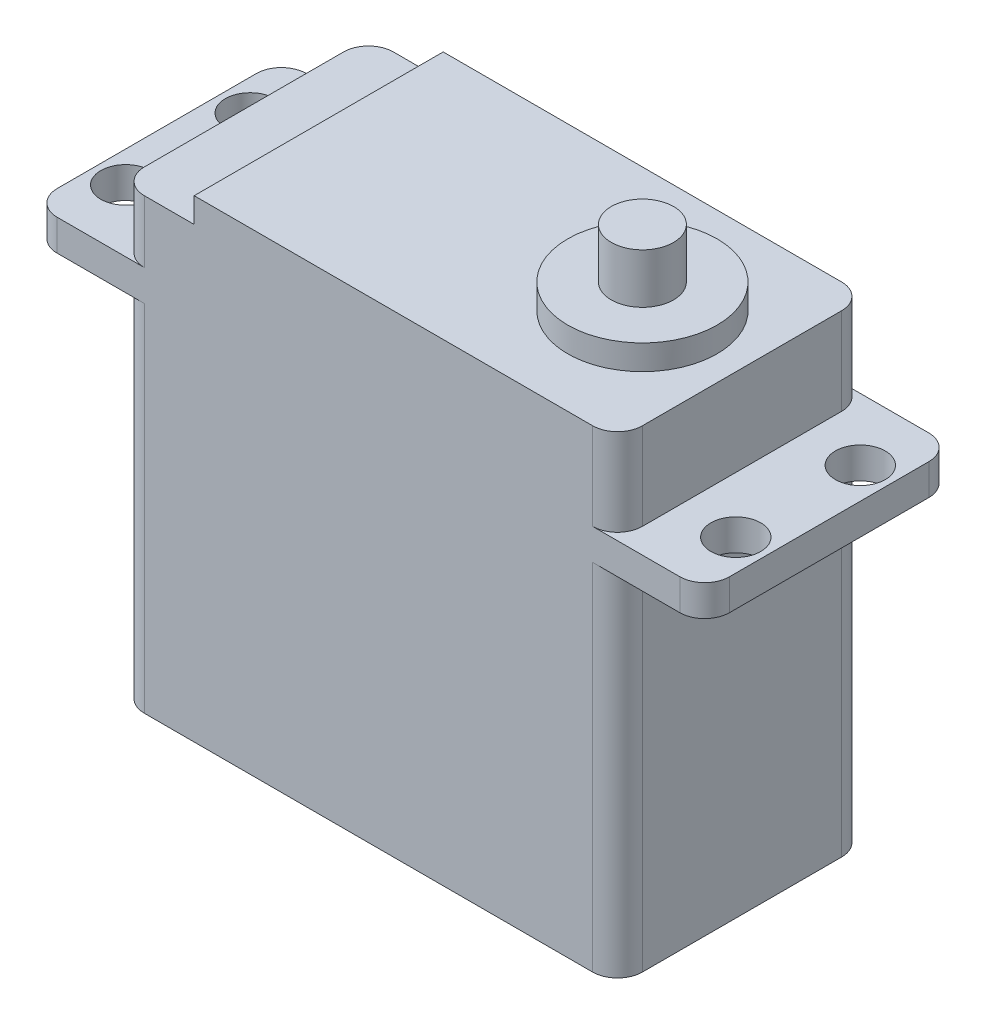
ISO-10303-21;
HEADER;
FILE_DESCRIPTION(('STEP AP214'),'2;1');
FILE_NAME('part.step','',(''),(''),'','','');
FILE_SCHEMA(('AUTOMOTIVE_DESIGN { 1 0 10303 214 1 1 1 1 }'));
ENDSEC;
DATA;
#1=APPLICATION_CONTEXT('core data for automotive mechanical design processes');
#2=APPLICATION_PROTOCOL_DEFINITION('international standard','automotive_design',2000,#1);
#3=PRODUCT_CONTEXT('',#1,'mechanical');
#4=PRODUCT('Part','Part','',(#3));
#5=PRODUCT_RELATED_PRODUCT_CATEGORY('part','',(#4));
#6=PRODUCT_DEFINITION_FORMATION('','',#4);
#7=PRODUCT_DEFINITION_CONTEXT('part definition',#1,'design');
#8=PRODUCT_DEFINITION('design','',#6,#7);
#9=PRODUCT_DEFINITION_SHAPE('','',#8);
#10=(LENGTH_UNIT() NAMED_UNIT(*) SI_UNIT(.MILLI.,.METRE.));
#11=(NAMED_UNIT(*) PLANE_ANGLE_UNIT() SI_UNIT($,.RADIAN.));
#12=(NAMED_UNIT(*) SI_UNIT($,.STERADIAN.) SOLID_ANGLE_UNIT());
#13=UNCERTAINTY_MEASURE_WITH_UNIT(LENGTH_MEASURE(1.E-05),#10,'distance_accuracy_value','');
#14=(GEOMETRIC_REPRESENTATION_CONTEXT(3) GLOBAL_UNCERTAINTY_ASSIGNED_CONTEXT((#13)) GLOBAL_UNIT_ASSIGNED_CONTEXT((#10,
#11,#12)) REPRESENTATION_CONTEXT('',''));
#15=CARTESIAN_POINT('',(0.,0.,0.));
#16=DIRECTION('',(0.,0.,1.));
#17=DIRECTION('',(1.,0.,0.));
#18=AXIS2_PLACEMENT_3D('',#15,#16,#17);
#19=CARTESIAN_POINT('',(40.,36.,-10.));
#20=DIRECTION('',(-1.,0.,0.));
#21=DIRECTION('',(0.,0.,1.));
#22=AXIS2_PLACEMENT_3D('',#19,#20,#21);
#23=PLANE('',#22);
#24=DIRECTION('',(0.,0.,1.));
#25=VECTOR('',#24,1.);
#26=CARTESIAN_POINT('',(40.,31.,10.));
#27=LINE('',#26,#25);
#28=CARTESIAN_POINT('',(40.,31.,-8.));
#29=VERTEX_POINT('',#28);
#30=CARTESIAN_POINT('',(40.,31.,7.99999999999999));
#31=VERTEX_POINT('',#30);
#32=EDGE_CURVE('E385',#29,#31,#27,.T.);
#33=ORIENTED_EDGE('',*,*,#32,.F.);
#34=DIRECTION('',(0.,-1.,0.));
#35=VECTOR('',#34,1.);
#36=CARTESIAN_POINT('',(40.,36.,-8.));
#37=LINE('',#36,#35);
#38=CARTESIAN_POINT('',(40.,38.,-8.));
#39=VERTEX_POINT('',#38);
#40=EDGE_CURVE('E333',#29,#39,#37,.F.);
#41=ORIENTED_EDGE('',*,*,#40,.T.);
#42=DIRECTION('',(0.,0.,-1.));
#43=VECTOR('',#42,1.);
#44=CARTESIAN_POINT('',(40.,38.,-10.));
#45=LINE('',#44,#43);
#46=CARTESIAN_POINT('',(40.,38.,7.99999999999999));
#47=VERTEX_POINT('',#46);
#48=EDGE_CURVE('E221',#47,#39,#45,.T.);
#49=ORIENTED_EDGE('',*,*,#48,.F.);
#50=DIRECTION('',(0.,-1.,0.));
#51=VECTOR('',#50,1.);
#52=CARTESIAN_POINT('',(40.,36.,7.99999999999999));
#53=LINE('',#52,#51);
#54=EDGE_CURVE('E330',#47,#31,#53,.T.);
#55=ORIENTED_EDGE('',*,*,#54,.T.);
#56=EDGE_LOOP('',(#33,#41,#49,#55));
#57=FACE_BOUND('',#56,.T.);
#58=ADVANCED_FACE('F37',(#57),#23,.F.);
#59=DIRECTION('',(0.,0.,-1.));
#60=VECTOR('',#59,1.);
#61=CARTESIAN_POINT('',(40.,0.,-10.));
#62=LINE('',#61,#60);
#63=CARTESIAN_POINT('',(40.,0.,7.99999999999999));
#64=VERTEX_POINT('',#63);
#65=CARTESIAN_POINT('',(40.,0.,-8.));
#66=VERTEX_POINT('',#65);
#67=EDGE_CURVE('E255',#64,#66,#62,.T.);
#68=ORIENTED_EDGE('',*,*,#67,.T.);
#69=DIRECTION('',(0.,-1.,0.));
#70=VECTOR('',#69,1.);
#71=CARTESIAN_POINT('',(40.,36.,-8.));
#72=LINE('',#71,#70);
#73=CARTESIAN_POINT('',(40.,28.5,-8.));
#74=VERTEX_POINT('',#73);
#75=EDGE_CURVE('E359',#66,#74,#72,.F.);
#76=ORIENTED_EDGE('',*,*,#75,.T.);
#77=DIRECTION('',(0.,0.,-1.));
#78=VECTOR('',#77,1.);
#79=CARTESIAN_POINT('',(40.,28.5,-10.));
#80=LINE('',#79,#78);
#81=CARTESIAN_POINT('',(40.,28.5,7.99999999999999));
#82=VERTEX_POINT('',#81);
#83=EDGE_CURVE('E376',#82,#74,#80,.T.);
#84=ORIENTED_EDGE('',*,*,#83,.F.);
#85=DIRECTION('',(0.,-1.,0.));
#86=VECTOR('',#85,1.);
#87=CARTESIAN_POINT('',(40.,36.,7.99999999999999));
#88=LINE('',#87,#86);
#89=EDGE_CURVE('E356',#82,#64,#88,.T.);
#90=ORIENTED_EDGE('',*,*,#89,.T.);
#91=EDGE_LOOP('',(#68,#76,#84,#90));
#92=FACE_BOUND('',#91,.T.);
#93=ADVANCED_FACE('F382',(#92),#23,.F.);
#94=CARTESIAN_POINT('',(0.,36.,0.));
#95=DIRECTION('',(1.,0.,0.));
#96=DIRECTION('',(0.,0.,-1.));
#97=AXIS2_PLACEMENT_3D('',#94,#95,#96);
#98=PLANE('',#97);
#99=DIRECTION('',(0.,0.,1.));
#100=VECTOR('',#99,1.);
#101=CARTESIAN_POINT('',(0.,36.,10.));
#102=LINE('',#101,#100);
#103=CARTESIAN_POINT('',(0.,36.,-8.));
#104=VERTEX_POINT('',#103);
#105=CARTESIAN_POINT('',(0.,36.,8.));
#106=VERTEX_POINT('',#105);
#107=EDGE_CURVE('E245',#104,#106,#102,.T.);
#108=ORIENTED_EDGE('',*,*,#107,.F.);
#109=DIRECTION('',(0.,-1.,0.));
#110=VECTOR('',#109,1.);
#111=CARTESIAN_POINT('',(0.,36.,-8.));
#112=LINE('',#111,#110);
#113=CARTESIAN_POINT('',(0.,31.,-8.));
#114=VERTEX_POINT('',#113);
#115=EDGE_CURVE('E267',#104,#114,#112,.T.);
#116=ORIENTED_EDGE('',*,*,#115,.T.);
#117=DIRECTION('',(0.,0.,-1.));
#118=VECTOR('',#117,1.);
#119=CARTESIAN_POINT('',(0.,31.,-10.));
#120=LINE('',#119,#118);
#121=CARTESIAN_POINT('',(0.,31.,8.));
#122=VERTEX_POINT('',#121);
#123=EDGE_CURVE('E462',#122,#114,#120,.T.);
#124=ORIENTED_EDGE('',*,*,#123,.F.);
#125=DIRECTION('',(0.,-1.,0.));
#126=VECTOR('',#125,1.);
#127=CARTESIAN_POINT('',(0.,36.,8.));
#128=LINE('',#127,#126);
#129=EDGE_CURVE('E265',#122,#106,#128,.F.);
#130=ORIENTED_EDGE('',*,*,#129,.T.);
#131=EDGE_LOOP('',(#108,#116,#124,#130));
#132=FACE_BOUND('',#131,.T.);
#133=ADVANCED_FACE('F506',(#132),#98,.F.);
#134=DIRECTION('',(0.,0.,1.));
#135=VECTOR('',#134,1.);
#136=CARTESIAN_POINT('',(0.,0.,0.));
#137=LINE('',#136,#135);
#138=CARTESIAN_POINT('',(0.,0.,-8.));
#139=VERTEX_POINT('',#138);
#140=CARTESIAN_POINT('',(0.,0.,8.));
#141=VERTEX_POINT('',#140);
#142=EDGE_CURVE('E249',#139,#141,#137,.T.);
#143=ORIENTED_EDGE('',*,*,#142,.T.);
#144=DIRECTION('',(0.,-1.,0.));
#145=VECTOR('',#144,1.);
#146=CARTESIAN_POINT('',(0.,36.,8.));
#147=LINE('',#146,#145);
#148=CARTESIAN_POINT('',(0.,28.5,8.));
#149=VERTEX_POINT('',#148);
#150=EDGE_CURVE('E297',#141,#149,#147,.F.);
#151=ORIENTED_EDGE('',*,*,#150,.T.);
#152=DIRECTION('',(0.,0.,1.));
#153=VECTOR('',#152,1.);
#154=CARTESIAN_POINT('',(0.,28.5,10.));
#155=LINE('',#154,#153);
#156=CARTESIAN_POINT('',(0.,28.5,-8.));
#157=VERTEX_POINT('',#156);
#158=EDGE_CURVE('E407',#157,#149,#155,.T.);
#159=ORIENTED_EDGE('',*,*,#158,.F.);
#160=DIRECTION('',(0.,-1.,0.));
#161=VECTOR('',#160,1.);
#162=CARTESIAN_POINT('',(0.,36.,-8.));
#163=LINE('',#162,#161);
#164=EDGE_CURVE('E294',#157,#139,#163,.T.);
#165=ORIENTED_EDGE('',*,*,#164,.T.);
#166=EDGE_LOOP('',(#143,#151,#159,#165));
#167=FACE_BOUND('',#166,.T.);
#168=ADVANCED_FACE('F403',(#167),#98,.F.);
#169=CARTESIAN_POINT('',(0.,36.,0.));
#170=DIRECTION('',(0.,-1.,0.));
#171=DIRECTION('',(0.,0.,-1.));
#172=AXIS2_PLACEMENT_3D('',#169,#170,#171);
#173=PLANE('',#172);
#174=DIRECTION('',(-1.,0.,0.));
#175=VECTOR('',#174,1.);
#176=CARTESIAN_POINT('',(0.,36.,-10.));
#177=LINE('',#176,#175);
#178=CARTESIAN_POINT('',(6.,36.,-10.));
#179=VERTEX_POINT('',#178);
#180=CARTESIAN_POINT('',(2.,36.,-10.));
#181=VERTEX_POINT('',#180);
#182=EDGE_CURVE('E228',#179,#181,#177,.T.);
#183=ORIENTED_EDGE('',*,*,#182,.T.);
#184=CARTESIAN_POINT('',(2.,36.,-8.));
#185=DIRECTION('',(0.,-1.,0.));
#186=DIRECTION('',(0.,0.,-1.));
#187=AXIS2_PLACEMENT_3D('',#184,#185,#186);
#188=CIRCLE('',#187,2.);
#189=EDGE_CURVE('E279',#181,#104,#188,.F.);
#190=ORIENTED_EDGE('',*,*,#189,.T.);
#191=ORIENTED_EDGE('',*,*,#107,.T.);
#192=CARTESIAN_POINT('',(2.,36.,8.));
#193=DIRECTION('',(0.,-1.,0.));
#194=DIRECTION('',(0.,0.,-1.));
#195=AXIS2_PLACEMENT_3D('',#192,#193,#194);
#196=CIRCLE('',#195,2.);
#197=CARTESIAN_POINT('',(2.,36.,10.));
#198=VERTEX_POINT('',#197);
#199=EDGE_CURVE('E277',#106,#198,#196,.F.);
#200=ORIENTED_EDGE('',*,*,#199,.T.);
#201=DIRECTION('',(1.,0.,0.));
#202=VECTOR('',#201,1.);
#203=CARTESIAN_POINT('',(40.,36.,10.));
#204=LINE('',#203,#202);
#205=CARTESIAN_POINT('',(6.,36.,10.));
#206=VERTEX_POINT('',#205);
#207=EDGE_CURVE('E248',#198,#206,#204,.T.);
#208=ORIENTED_EDGE('',*,*,#207,.T.);
#209=DIRECTION('',(0.,0.,1.));
#210=VECTOR('',#209,1.);
#211=CARTESIAN_POINT('',(6.,36.,10.));
#212=LINE('',#211,#210);
#213=EDGE_CURVE('E241',#179,#206,#212,.T.);
#214=ORIENTED_EDGE('',*,*,#213,.F.);
#215=EDGE_LOOP('',(#183,#190,#191,#200,#208,#214));
#216=FACE_BOUND('',#215,.T.);
#217=ADVANCED_FACE('F512',(#216),#173,.F.);
#218=CARTESIAN_POINT('',(40.,36.,10.));
#219=DIRECTION('',(0.,0.,-1.));
#220=DIRECTION('',(-1.,0.,0.));
#221=AXIS2_PLACEMENT_3D('',#218,#219,#220);
#222=PLANE('',#221);
#223=DIRECTION('',(1.,0.,0.));
#224=VECTOR('',#223,1.);
#225=CARTESIAN_POINT('',(40.,0.,10.));
#226=LINE('',#225,#224);
#227=CARTESIAN_POINT('',(2.,0.,10.));
#228=VERTEX_POINT('',#227);
#229=CARTESIAN_POINT('',(38.,0.,10.));
#230=VERTEX_POINT('',#229);
#231=EDGE_CURVE('E231',#228,#230,#226,.T.);
#232=ORIENTED_EDGE('',*,*,#231,.T.);
#233=DIRECTION('',(0.,-1.,0.));
#234=VECTOR('',#233,1.);
#235=CARTESIAN_POINT('',(38.,36.,10.));
#236=LINE('',#235,#234);
#237=CARTESIAN_POINT('',(38.,28.5,10.));
#238=VERTEX_POINT('',#237);
#239=EDGE_CURVE('E365',#230,#238,#236,.F.);
#240=ORIENTED_EDGE('',*,*,#239,.T.);
#241=DIRECTION('',(-1.,0.,0.));
#242=VECTOR('',#241,1.);
#243=CARTESIAN_POINT('',(47.,28.5,9.99999999999999));
#244=LINE('',#243,#242);
#245=CARTESIAN_POINT('',(45.,28.5,9.99999999999999));
#246=VERTEX_POINT('',#245);
#247=EDGE_CURVE('E52',#246,#238,#244,.T.);
#248=ORIENTED_EDGE('',*,*,#247,.F.);
#249=DIRECTION('',(0.,-1.,0.));
#250=VECTOR('',#249,1.);
#251=CARTESIAN_POINT('',(45.,36.,10.));
#252=LINE('',#251,#250);
#253=CARTESIAN_POINT('',(45.,31.,9.99999999999999));
#254=VERTEX_POINT('',#253);
#255=EDGE_CURVE('E361',#246,#254,#252,.F.);
#256=ORIENTED_EDGE('',*,*,#255,.T.);
#257=DIRECTION('',(-1.,0.,0.));
#258=VECTOR('',#257,1.);
#259=CARTESIAN_POINT('',(47.,31.,9.99999999999999));
#260=LINE('',#259,#258);
#261=CARTESIAN_POINT('',(38.,31.,10.));
#262=VERTEX_POINT('',#261);
#263=EDGE_CURVE('E60',#254,#262,#260,.T.);
#264=ORIENTED_EDGE('',*,*,#263,.T.);
#265=DIRECTION('',(0.,-1.,0.));
#266=VECTOR('',#265,1.);
#267=CARTESIAN_POINT('',(38.,36.,10.));
#268=LINE('',#267,#266);
#269=CARTESIAN_POINT('',(38.,38.,10.));
#270=VERTEX_POINT('',#269);
#271=EDGE_CURVE('E363',#262,#270,#268,.F.);
#272=ORIENTED_EDGE('',*,*,#271,.T.);
#273=DIRECTION('',(1.,0.,0.));
#274=VECTOR('',#273,1.);
#275=CARTESIAN_POINT('',(40.,38.,10.));
#276=LINE('',#275,#274);
#277=CARTESIAN_POINT('',(6.,38.,10.));
#278=VERTEX_POINT('',#277);
#279=EDGE_CURVE('E242',#278,#270,#276,.T.);
#280=ORIENTED_EDGE('',*,*,#279,.F.);
#281=DIRECTION('',(0.,-1.,0.));
#282=VECTOR('',#281,1.);
#283=CARTESIAN_POINT('',(6.,38.,10.));
#284=LINE('',#283,#282);
#285=EDGE_CURVE('E232',#278,#206,#284,.T.);
#286=ORIENTED_EDGE('',*,*,#285,.T.);
#287=ORIENTED_EDGE('',*,*,#207,.F.);
#288=DIRECTION('',(0.,-1.,0.));
#289=VECTOR('',#288,1.);
#290=CARTESIAN_POINT('',(2.,36.,10.));
#291=LINE('',#290,#289);
#292=CARTESIAN_POINT('',(2.,31.,10.));
#293=VERTEX_POINT('',#292);
#294=EDGE_CURVE('E286',#198,#293,#291,.T.);
#295=ORIENTED_EDGE('',*,*,#294,.T.);
#296=DIRECTION('',(1.,0.,0.));
#297=VECTOR('',#296,1.);
#298=CARTESIAN_POINT('',(-7.,31.,10.));
#299=LINE('',#298,#297);
#300=CARTESIAN_POINT('',(-5.,31.,10.));
#301=VERTEX_POINT('',#300);
#302=EDGE_CURVE('E470',#301,#293,#299,.T.);
#303=ORIENTED_EDGE('',*,*,#302,.F.);
#304=DIRECTION('',(0.,1.,0.));
#305=VECTOR('',#304,1.);
#306=CARTESIAN_POINT('',(-5.,36.,10.));
#307=LINE('',#306,#305);
#308=CARTESIAN_POINT('',(-5.,28.5,10.));
#309=VERTEX_POINT('',#308);
#310=EDGE_CURVE('E281',#301,#309,#307,.F.);
#311=ORIENTED_EDGE('',*,*,#310,.T.);
#312=DIRECTION('',(1.,0.,0.));
#313=VECTOR('',#312,1.);
#314=CARTESIAN_POINT('',(-7.,28.5,10.));
#315=LINE('',#314,#313);
#316=CARTESIAN_POINT('',(2.,28.5,10.));
#317=VERTEX_POINT('',#316);
#318=EDGE_CURVE('E396',#309,#317,#315,.T.);
#319=ORIENTED_EDGE('',*,*,#318,.T.);
#320=DIRECTION('',(0.,-1.,0.));
#321=VECTOR('',#320,1.);
#322=CARTESIAN_POINT('',(2.,36.,10.));
#323=LINE('',#322,#321);
#324=EDGE_CURVE('E283',#317,#228,#323,.T.);
#325=ORIENTED_EDGE('',*,*,#324,.T.);
#326=EDGE_LOOP('',(#232,#240,#248,#256,#264,#272,#280,#286,#287,#295,#303,#311,#319,#325));
#327=FACE_BOUND('',#326,.T.);
#328=ADVANCED_FACE('F393',(#327),#222,.F.);
#329=CARTESIAN_POINT('',(0.,36.,-10.));
#330=DIRECTION('',(0.,0.,1.));
#331=DIRECTION('',(1.,0.,0.));
#332=AXIS2_PLACEMENT_3D('',#329,#330,#331);
#333=PLANE('',#332);
#334=DIRECTION('',(-1.,0.,0.));
#335=VECTOR('',#334,1.);
#336=CARTESIAN_POINT('',(6.,38.,-10.));
#337=LINE('',#336,#335);
#338=CARTESIAN_POINT('',(38.,38.,-10.));
#339=VERTEX_POINT('',#338);
#340=CARTESIAN_POINT('',(6.,38.,-10.));
#341=VERTEX_POINT('',#340);
#342=EDGE_CURVE('E208',#339,#341,#337,.T.);
#343=ORIENTED_EDGE('',*,*,#342,.F.);
#344=DIRECTION('',(0.,-1.,0.));
#345=VECTOR('',#344,1.);
#346=CARTESIAN_POINT('',(38.,36.,-10.));
#347=LINE('',#346,#345);
#348=CARTESIAN_POINT('',(38.,31.,-10.));
#349=VERTEX_POINT('',#348);
#350=EDGE_CURVE('E328',#339,#349,#347,.T.);
#351=ORIENTED_EDGE('',*,*,#350,.T.);
#352=DIRECTION('',(-1.,0.,0.));
#353=VECTOR('',#352,1.);
#354=CARTESIAN_POINT('',(47.,31.,-10.));
#355=LINE('',#354,#353);
#356=CARTESIAN_POINT('',(45.,31.,-10.));
#357=VERTEX_POINT('',#356);
#358=EDGE_CURVE('E420',#357,#349,#355,.T.);
#359=ORIENTED_EDGE('',*,*,#358,.F.);
#360=DIRECTION('',(0.,1.,0.));
#361=VECTOR('',#360,1.);
#362=CARTESIAN_POINT('',(45.,36.,-10.));
#363=LINE('',#362,#361);
#364=CARTESIAN_POINT('',(45.,28.5,-10.));
#365=VERTEX_POINT('',#364);
#366=EDGE_CURVE('E326',#357,#365,#363,.F.);
#367=ORIENTED_EDGE('',*,*,#366,.T.);
#368=DIRECTION('',(-1.,0.,0.));
#369=VECTOR('',#368,1.);
#370=CARTESIAN_POINT('',(47.,28.5,-10.));
#371=LINE('',#370,#369);
#372=CARTESIAN_POINT('',(38.,28.5,-10.));
#373=VERTEX_POINT('',#372);
#374=EDGE_CURVE('E414',#365,#373,#371,.T.);
#375=ORIENTED_EDGE('',*,*,#374,.T.);
#376=DIRECTION('',(0.,-1.,0.));
#377=VECTOR('',#376,1.);
#378=CARTESIAN_POINT('',(38.,36.,-10.));
#379=LINE('',#378,#377);
#380=CARTESIAN_POINT('',(38.,0.,-10.));
#381=VERTEX_POINT('',#380);
#382=EDGE_CURVE('E323',#373,#381,#379,.T.);
#383=ORIENTED_EDGE('',*,*,#382,.T.);
#384=DIRECTION('',(-1.,0.,0.));
#385=VECTOR('',#384,1.);
#386=CARTESIAN_POINT('',(0.,0.,-10.));
#387=LINE('',#386,#385);
#388=CARTESIAN_POINT('',(2.,0.,-10.));
#389=VERTEX_POINT('',#388);
#390=EDGE_CURVE('E258',#381,#389,#387,.T.);
#391=ORIENTED_EDGE('',*,*,#390,.T.);
#392=DIRECTION('',(0.,-1.,0.));
#393=VECTOR('',#392,1.);
#394=CARTESIAN_POINT('',(2.,36.,-10.));
#395=LINE('',#394,#393);
#396=CARTESIAN_POINT('',(2.,28.5,-10.));
#397=VERTEX_POINT('',#396);
#398=EDGE_CURVE('E272',#389,#397,#395,.F.);
#399=ORIENTED_EDGE('',*,*,#398,.T.);
#400=DIRECTION('',(1.,0.,0.));
#401=VECTOR('',#400,1.);
#402=CARTESIAN_POINT('',(-7.,28.5,-10.));
#403=LINE('',#402,#401);
#404=CARTESIAN_POINT('',(-5.,28.5,-10.));
#405=VERTEX_POINT('',#404);
#406=EDGE_CURVE('E473',#405,#397,#403,.T.);
#407=ORIENTED_EDGE('',*,*,#406,.F.);
#408=DIRECTION('',(0.,-1.,0.));
#409=VECTOR('',#408,1.);
#410=CARTESIAN_POINT('',(-5.,36.,-10.));
#411=LINE('',#410,#409);
#412=CARTESIAN_POINT('',(-5.,31.,-10.));
#413=VERTEX_POINT('',#412);
#414=EDGE_CURVE('E270',#405,#413,#411,.F.);
#415=ORIENTED_EDGE('',*,*,#414,.T.);
#416=DIRECTION('',(1.,0.,0.));
#417=VECTOR('',#416,1.);
#418=CARTESIAN_POINT('',(-7.,31.,-10.));
#419=LINE('',#418,#417);
#420=CARTESIAN_POINT('',(2.,31.,-10.));
#421=VERTEX_POINT('',#420);
#422=EDGE_CURVE('E465',#413,#421,#419,.T.);
#423=ORIENTED_EDGE('',*,*,#422,.T.);
#424=DIRECTION('',(0.,-1.,0.));
#425=VECTOR('',#424,1.);
#426=CARTESIAN_POINT('',(2.,36.,-10.));
#427=LINE('',#426,#425);
#428=EDGE_CURVE('E275',#421,#181,#427,.F.);
#429=ORIENTED_EDGE('',*,*,#428,.T.);
#430=ORIENTED_EDGE('',*,*,#182,.F.);
#431=DIRECTION('',(0.,-1.,0.));
#432=VECTOR('',#431,1.);
#433=CARTESIAN_POINT('',(6.,38.,-10.));
#434=LINE('',#433,#432);
#435=EDGE_CURVE('E225',#341,#179,#434,.T.);
#436=ORIENTED_EDGE('',*,*,#435,.F.);
#437=EDGE_LOOP('',(#343,#351,#359,#367,#375,#383,#391,#399,#407,#415,#423,#429,#430,#436));
#438=FACE_BOUND('',#437,.T.);
#439=ADVANCED_FACE('F226',(#438),#333,.F.);
#440=CARTESIAN_POINT('',(0.,0.,0.));
#441=DIRECTION('',(0.,-1.,0.));
#442=DIRECTION('',(0.,0.,-1.));
#443=AXIS2_PLACEMENT_3D('',#440,#441,#442);
#444=PLANE('',#443);
#445=ORIENTED_EDGE('',*,*,#390,.F.);
#446=CARTESIAN_POINT('',(38.,0.,-8.));
#447=DIRECTION('',(0.,-1.,0.));
#448=DIRECTION('',(0.,0.,-1.));
#449=AXIS2_PLACEMENT_3D('',#446,#447,#448);
#450=CIRCLE('',#449,2.);
#451=EDGE_CURVE('E354',#381,#66,#450,.T.);
#452=ORIENTED_EDGE('',*,*,#451,.T.);
#453=ORIENTED_EDGE('',*,*,#67,.F.);
#454=CARTESIAN_POINT('',(38.,0.,7.99999999999999));
#455=DIRECTION('',(0.,-1.,0.));
#456=DIRECTION('',(0.,0.,-1.));
#457=AXIS2_PLACEMENT_3D('',#454,#455,#456);
#458=CIRCLE('',#457,2.);
#459=EDGE_CURVE('E352',#64,#230,#458,.T.);
#460=ORIENTED_EDGE('',*,*,#459,.T.);
#461=ORIENTED_EDGE('',*,*,#231,.F.);
#462=CARTESIAN_POINT('',(2.,0.,8.));
#463=DIRECTION('',(0.,-1.,0.));
#464=DIRECTION('',(0.,0.,-1.));
#465=AXIS2_PLACEMENT_3D('',#462,#463,#464);
#466=CIRCLE('',#465,2.);
#467=EDGE_CURVE('E292',#228,#141,#466,.T.);
#468=ORIENTED_EDGE('',*,*,#467,.T.);
#469=ORIENTED_EDGE('',*,*,#142,.F.);
#470=CARTESIAN_POINT('',(2.,0.,-8.));
#471=DIRECTION('',(0.,-1.,0.));
#472=DIRECTION('',(0.,0.,-1.));
#473=AXIS2_PLACEMENT_3D('',#470,#471,#472);
#474=CIRCLE('',#473,2.);
#475=EDGE_CURVE('E289',#139,#389,#474,.T.);
#476=ORIENTED_EDGE('',*,*,#475,.T.);
#477=EDGE_LOOP('',(#445,#452,#453,#460,#461,#468,#469,#476));
#478=FACE_BOUND('',#477,.T.);
#479=ADVANCED_FACE('F392',(#478),#444,.T.);
#480=CARTESIAN_POINT('',(6.,38.,10.));
#481=DIRECTION('',(1.,0.,0.));
#482=DIRECTION('',(0.,0.,-1.));
#483=AXIS2_PLACEMENT_3D('',#480,#481,#482);
#484=PLANE('',#483);
#485=ORIENTED_EDGE('',*,*,#213,.T.);
#486=ORIENTED_EDGE('',*,*,#285,.F.);
#487=DIRECTION('',(0.,0.,1.));
#488=VECTOR('',#487,1.);
#489=CARTESIAN_POINT('',(6.,38.,10.));
#490=LINE('',#489,#488);
#491=EDGE_CURVE('E214',#341,#278,#490,.T.);
#492=ORIENTED_EDGE('',*,*,#491,.F.);
#493=ORIENTED_EDGE('',*,*,#435,.T.);
#494=EDGE_LOOP('',(#485,#486,#492,#493));
#495=FACE_BOUND('',#494,.T.);
#496=ADVANCED_FACE('F234',(#495),#484,.F.);
#497=CARTESIAN_POINT('',(0.,38.,0.));
#498=DIRECTION('',(0.,-1.,0.));
#499=DIRECTION('',(0.,0.,-1.));
#500=AXIS2_PLACEMENT_3D('',#497,#498,#499);
#501=PLANE('',#500);
#502=CARTESIAN_POINT('',(32.,38.,0.));
#503=DIRECTION('',(0.,-1.,0.));
#504=DIRECTION('',(0.,0.,-1.));
#505=AXIS2_PLACEMENT_3D('',#502,#503,#504);
#506=CIRCLE('',#505,6.);
#507=CARTESIAN_POINT('',(32.,38.,-6.));
#508=VERTEX_POINT('',#507);
#509=EDGE_CURVE('E252',#508,#508,#506,.F.);
#510=ORIENTED_EDGE('',*,*,#509,.F.);
#511=EDGE_LOOP('',(#510));
#512=FACE_BOUND('',#511,.T.);
#513=ORIENTED_EDGE('',*,*,#48,.T.);
#514=CARTESIAN_POINT('',(38.,38.,-8.));
#515=DIRECTION('',(0.,-1.,0.));
#516=DIRECTION('',(0.,0.,-1.));
#517=AXIS2_PLACEMENT_3D('',#514,#515,#516);
#518=CIRCLE('',#517,2.);
#519=EDGE_CURVE('E217',#39,#339,#518,.F.);
#520=ORIENTED_EDGE('',*,*,#519,.T.);
#521=ORIENTED_EDGE('',*,*,#342,.T.);
#522=ORIENTED_EDGE('',*,*,#491,.T.);
#523=ORIENTED_EDGE('',*,*,#279,.T.);
#524=CARTESIAN_POINT('',(38.,38.,7.99999999999999));
#525=DIRECTION('',(0.,-1.,0.));
#526=DIRECTION('',(0.,0.,-1.));
#527=AXIS2_PLACEMENT_3D('',#524,#525,#526);
#528=CIRCLE('',#527,2.);
#529=EDGE_CURVE('E335',#270,#47,#528,.F.);
#530=ORIENTED_EDGE('',*,*,#529,.T.);
#531=EDGE_LOOP('',(#513,#520,#521,#522,#523,#530));
#532=FACE_BOUND('',#531,.T.);
#533=ADVANCED_FACE('F211',(#512,#532),#501,.F.);
#534=CARTESIAN_POINT('',(32.,40.,0.));
#535=DIRECTION('',(0.,-1.,0.));
#536=DIRECTION('',(0.,0.,-1.));
#537=AXIS2_PLACEMENT_3D('',#534,#535,#536);
#538=CYLINDRICAL_SURFACE('',#537,6.);
#539=CARTESIAN_POINT('',(32.,40.,0.));
#540=DIRECTION('',(0.,1.,0.));
#541=DIRECTION('',(0.,0.,1.));
#542=AXIS2_PLACEMENT_3D('',#539,#540,#541);
#543=CIRCLE('',#542,6.);
#544=CARTESIAN_POINT('',(32.,40.,6.));
#545=VERTEX_POINT('',#544);
#546=EDGE_CURVE('E243',#545,#545,#543,.T.);
#547=ORIENTED_EDGE('',*,*,#546,.F.);
#548=EDGE_LOOP('',(#547));
#549=FACE_BOUND('',#548,.T.);
#550=ORIENTED_EDGE('',*,*,#509,.T.);
#551=EDGE_LOOP('',(#550));
#552=FACE_BOUND('',#551,.T.);
#553=ADVANCED_FACE('F775',(#549,#552),#538,.T.);
#554=CARTESIAN_POINT('',(32.,40.,0.));
#555=DIRECTION('',(0.,1.,0.));
#556=DIRECTION('',(0.,0.,1.));
#557=AXIS2_PLACEMENT_3D('',#554,#555,#556);
#558=PLANE('',#557);
#559=CARTESIAN_POINT('',(32.,40.,0.));
#560=DIRECTION('',(0.,1.,0.));
#561=DIRECTION('',(0.,0.,1.));
#562=AXIS2_PLACEMENT_3D('',#559,#560,#561);
#563=CIRCLE('',#562,2.5);
#564=CARTESIAN_POINT('',(32.,40.,2.5));
#565=VERTEX_POINT('',#564);
#566=EDGE_CURVE('E264',#565,#565,#563,.T.);
#567=ORIENTED_EDGE('',*,*,#566,.F.);
#568=EDGE_LOOP('',(#567));
#569=FACE_BOUND('',#568,.T.);
#570=ORIENTED_EDGE('',*,*,#546,.T.);
#571=EDGE_LOOP('',(#570));
#572=FACE_BOUND('',#571,.T.);
#573=ADVANCED_FACE('F767',(#569,#572),#558,.T.);
#574=CARTESIAN_POINT('',(32.,44.,0.));
#575=DIRECTION('',(0.,-1.,0.));
#576=DIRECTION('',(0.,0.,-1.));
#577=AXIS2_PLACEMENT_3D('',#574,#575,#576);
#578=CYLINDRICAL_SURFACE('',#577,2.5);
#579=CARTESIAN_POINT('',(32.,44.,0.));
#580=DIRECTION('',(0.,1.,0.));
#581=DIRECTION('',(0.,0.,1.));
#582=AXIS2_PLACEMENT_3D('',#579,#580,#581);
#583=CIRCLE('',#582,2.5);
#584=CARTESIAN_POINT('',(32.,44.,2.5));
#585=VERTEX_POINT('',#584);
#586=EDGE_CURVE('E475',#585,#585,#583,.T.);
#587=ORIENTED_EDGE('',*,*,#586,.F.);
#588=EDGE_LOOP('',(#587));
#589=FACE_BOUND('',#588,.T.);
#590=ORIENTED_EDGE('',*,*,#566,.T.);
#591=EDGE_LOOP('',(#590));
#592=FACE_BOUND('',#591,.T.);
#593=ADVANCED_FACE('F760',(#589,#592),#578,.T.);
#594=CARTESIAN_POINT('',(32.,44.,0.));
#595=DIRECTION('',(0.,1.,0.));
#596=DIRECTION('',(0.,0.,1.));
#597=AXIS2_PLACEMENT_3D('',#594,#595,#596);
#598=PLANE('',#597);
#599=ORIENTED_EDGE('',*,*,#586,.T.);
#600=EDGE_LOOP('',(#599));
#601=FACE_BOUND('',#600,.T.);
#602=ADVANCED_FACE('F725',(#601),#598,.T.);
#603=CARTESIAN_POINT('',(-7.,28.5,10.));
#604=DIRECTION('',(0.,1.,0.));
#605=DIRECTION('',(0.,0.,1.));
#606=AXIS2_PLACEMENT_3D('',#603,#604,#605);
#607=PLANE('',#606);
#608=CARTESIAN_POINT('',(-4.5,28.5,-5.));
#609=DIRECTION('',(0.,1.,0.));
#610=DIRECTION('',(0.,0.,1.));
#611=AXIS2_PLACEMENT_3D('',#608,#609,#610);
#612=CIRCLE('',#611,2.);
#613=CARTESIAN_POINT('',(-4.5,28.5,-3.));
#614=VERTEX_POINT('',#613);
#615=EDGE_CURVE('E450',#614,#614,#612,.F.);
#616=ORIENTED_EDGE('',*,*,#615,.F.);
#617=EDGE_LOOP('',(#616));
#618=FACE_BOUND('',#617,.T.);
#619=CARTESIAN_POINT('',(-4.5,28.5,5.));
#620=DIRECTION('',(0.,1.,0.));
#621=DIRECTION('',(0.,0.,1.));
#622=AXIS2_PLACEMENT_3D('',#619,#620,#621);
#623=CIRCLE('',#622,2.);
#624=CARTESIAN_POINT('',(-4.5,28.5,7.));
#625=VERTEX_POINT('',#624);
#626=EDGE_CURVE('E451',#625,#625,#623,.F.);
#627=ORIENTED_EDGE('',*,*,#626,.F.);
#628=EDGE_LOOP('',(#627));
#629=FACE_BOUND('',#628,.T.);
#630=DIRECTION('',(0.,0.,1.));
#631=VECTOR('',#630,1.);
#632=CARTESIAN_POINT('',(-7.,28.5,10.));
#633=LINE('',#632,#631);
#634=CARTESIAN_POINT('',(-7.,28.5,-8.));
#635=VERTEX_POINT('',#634);
#636=CARTESIAN_POINT('',(-7.,28.5,8.));
#637=VERTEX_POINT('',#636);
#638=EDGE_CURVE('E458',#635,#637,#633,.T.);
#639=ORIENTED_EDGE('',*,*,#638,.F.);
#640=CARTESIAN_POINT('',(-5.,28.5,-8.));
#641=DIRECTION('',(0.,1.,0.));
#642=DIRECTION('',(0.,0.,1.));
#643=AXIS2_PLACEMENT_3D('',#640,#641,#642);
#644=CIRCLE('',#643,2.);
#645=EDGE_CURVE('E307',#635,#405,#644,.F.);
#646=ORIENTED_EDGE('',*,*,#645,.T.);
#647=ORIENTED_EDGE('',*,*,#406,.T.);
#648=CARTESIAN_POINT('',(2.,28.5,-8.));
#649=DIRECTION('',(0.,1.,0.));
#650=DIRECTION('',(0.,0.,1.));
#651=AXIS2_PLACEMENT_3D('',#648,#649,#650);
#652=CIRCLE('',#651,2.);
#653=EDGE_CURVE('E321',#397,#157,#652,.T.);
#654=ORIENTED_EDGE('',*,*,#653,.T.);
#655=ORIENTED_EDGE('',*,*,#158,.T.);
#656=CARTESIAN_POINT('',(2.,28.5,8.));
#657=DIRECTION('',(0.,1.,0.));
#658=DIRECTION('',(0.,0.,1.));
#659=AXIS2_PLACEMENT_3D('',#656,#657,#658);
#660=CIRCLE('',#659,2.);
#661=EDGE_CURVE('E318',#149,#317,#660,.T.);
#662=ORIENTED_EDGE('',*,*,#661,.T.);
#663=ORIENTED_EDGE('',*,*,#318,.F.);
#664=CARTESIAN_POINT('',(-5.,28.5,8.));
#665=DIRECTION('',(0.,1.,0.));
#666=DIRECTION('',(0.,0.,1.));
#667=AXIS2_PLACEMENT_3D('',#664,#665,#666);
#668=CIRCLE('',#667,2.);
#669=EDGE_CURVE('E305',#309,#637,#668,.F.);
#670=ORIENTED_EDGE('',*,*,#669,.T.);
#671=EDGE_LOOP('',(#639,#646,#647,#654,#655,#662,#663,#670));
#672=FACE_BOUND('',#671,.T.);
#673=ADVANCED_FACE('F717',(#618,#629,#672),#607,.F.);
#674=CARTESIAN_POINT('',(-7.,31.,-10.));
#675=DIRECTION('',(0.,-1.,0.));
#676=DIRECTION('',(0.,0.,-1.));
#677=AXIS2_PLACEMENT_3D('',#674,#675,#676);
#678=PLANE('',#677);
#679=CARTESIAN_POINT('',(-4.5,31.,-5.));
#680=DIRECTION('',(0.,1.,0.));
#681=DIRECTION('',(0.,0.,1.));
#682=AXIS2_PLACEMENT_3D('',#679,#680,#681);
#683=CIRCLE('',#682,2.);
#684=CARTESIAN_POINT('',(-4.5,31.,-3.));
#685=VERTEX_POINT('',#684);
#686=EDGE_CURVE('E447',#685,#685,#683,.T.);
#687=ORIENTED_EDGE('',*,*,#686,.F.);
#688=EDGE_LOOP('',(#687));
#689=FACE_BOUND('',#688,.T.);
#690=CARTESIAN_POINT('',(-4.5,31.,5.));
#691=DIRECTION('',(0.,1.,0.));
#692=DIRECTION('',(0.,0.,1.));
#693=AXIS2_PLACEMENT_3D('',#690,#691,#692);
#694=CIRCLE('',#693,2.);
#695=CARTESIAN_POINT('',(-4.5,31.,7.));
#696=VERTEX_POINT('',#695);
#697=EDGE_CURVE('E446',#696,#696,#694,.T.);
#698=ORIENTED_EDGE('',*,*,#697,.F.);
#699=EDGE_LOOP('',(#698));
#700=FACE_BOUND('',#699,.T.);
#701=ORIENTED_EDGE('',*,*,#422,.F.);
#702=CARTESIAN_POINT('',(-5.,31.,-8.));
#703=DIRECTION('',(0.,-1.,0.));
#704=DIRECTION('',(0.,0.,-1.));
#705=AXIS2_PLACEMENT_3D('',#702,#703,#704);
#706=CIRCLE('',#705,2.);
#707=CARTESIAN_POINT('',(-7.,31.,-8.));
#708=VERTEX_POINT('',#707);
#709=EDGE_CURVE('E311',#413,#708,#706,.F.);
#710=ORIENTED_EDGE('',*,*,#709,.T.);
#711=DIRECTION('',(0.,0.,-1.));
#712=VECTOR('',#711,1.);
#713=CARTESIAN_POINT('',(-7.,31.,-10.));
#714=LINE('',#713,#712);
#715=CARTESIAN_POINT('',(-7.,31.,8.));
#716=VERTEX_POINT('',#715);
#717=EDGE_CURVE('E461',#716,#708,#714,.T.);
#718=ORIENTED_EDGE('',*,*,#717,.F.);
#719=CARTESIAN_POINT('',(-5.,31.,8.));
#720=DIRECTION('',(0.,-1.,0.));
#721=DIRECTION('',(0.,0.,-1.));
#722=AXIS2_PLACEMENT_3D('',#719,#720,#721);
#723=CIRCLE('',#722,2.);
#724=EDGE_CURVE('E309',#716,#301,#723,.F.);
#725=ORIENTED_EDGE('',*,*,#724,.T.);
#726=ORIENTED_EDGE('',*,*,#302,.T.);
#727=CARTESIAN_POINT('',(2.,31.,8.));
#728=DIRECTION('',(0.,-1.,0.));
#729=DIRECTION('',(0.,0.,-1.));
#730=AXIS2_PLACEMENT_3D('',#727,#728,#729);
#731=CIRCLE('',#730,2.);
#732=EDGE_CURVE('E316',#293,#122,#731,.T.);
#733=ORIENTED_EDGE('',*,*,#732,.T.);
#734=ORIENTED_EDGE('',*,*,#123,.T.);
#735=CARTESIAN_POINT('',(2.,31.,-8.));
#736=DIRECTION('',(0.,-1.,0.));
#737=DIRECTION('',(0.,0.,-1.));
#738=AXIS2_PLACEMENT_3D('',#735,#736,#737);
#739=CIRCLE('',#738,2.);
#740=EDGE_CURVE('E313',#114,#421,#739,.T.);
#741=ORIENTED_EDGE('',*,*,#740,.T.);
#742=EDGE_LOOP('',(#701,#710,#718,#725,#726,#733,#734,#741));
#743=FACE_BOUND('',#742,.T.);
#744=ADVANCED_FACE('F709',(#689,#700,#743),#678,.F.);
#745=CARTESIAN_POINT('',(-7.,0.,0.));
#746=DIRECTION('',(1.,0.,0.));
#747=DIRECTION('',(0.,0.,-1.));
#748=AXIS2_PLACEMENT_3D('',#745,#746,#747);
#749=PLANE('',#748);
#750=ORIENTED_EDGE('',*,*,#717,.T.);
#751=DIRECTION('',(0.,-1.,0.));
#752=VECTOR('',#751,1.);
#753=CARTESIAN_POINT('',(-7.,0.,-8.));
#754=LINE('',#753,#752);
#755=EDGE_CURVE('E302',#708,#635,#754,.T.);
#756=ORIENTED_EDGE('',*,*,#755,.T.);
#757=ORIENTED_EDGE('',*,*,#638,.T.);
#758=DIRECTION('',(0.,1.,0.));
#759=VECTOR('',#758,1.);
#760=CARTESIAN_POINT('',(-7.,0.,8.));
#761=LINE('',#760,#759);
#762=EDGE_CURVE('E299',#637,#716,#761,.T.);
#763=ORIENTED_EDGE('',*,*,#762,.T.);
#764=EDGE_LOOP('',(#750,#756,#757,#763));
#765=FACE_BOUND('',#764,.T.);
#766=ADVANCED_FACE('F700',(#765),#749,.F.);
#767=CARTESIAN_POINT('',(-4.5,-0.001000000000001,5.));
#768=DIRECTION('',(0.,1.,0.));
#769=DIRECTION('',(0.,0.,1.));
#770=AXIS2_PLACEMENT_3D('',#767,#768,#769);
#771=CYLINDRICAL_SURFACE('',#770,2.);
#772=ORIENTED_EDGE('',*,*,#697,.T.);
#773=EDGE_LOOP('',(#772));
#774=FACE_BOUND('',#773,.T.);
#775=ORIENTED_EDGE('',*,*,#626,.T.);
#776=EDGE_LOOP('',(#775));
#777=FACE_BOUND('',#776,.T.);
#778=ADVANCED_FACE('F690',(#774,#777),#771,.F.);
#779=CARTESIAN_POINT('',(-4.5,-0.001000000000001,-5.));
#780=DIRECTION('',(0.,1.,0.));
#781=DIRECTION('',(0.,0.,1.));
#782=AXIS2_PLACEMENT_3D('',#779,#780,#781);
#783=CYLINDRICAL_SURFACE('',#782,2.);
#784=ORIENTED_EDGE('',*,*,#686,.T.);
#785=EDGE_LOOP('',(#784));
#786=FACE_BOUND('',#785,.T.);
#787=ORIENTED_EDGE('',*,*,#615,.T.);
#788=EDGE_LOOP('',(#787));
#789=FACE_BOUND('',#788,.T.);
#790=ADVANCED_FACE('F517',(#786,#789),#783,.F.);
#791=CARTESIAN_POINT('',(2.,36.,-8.));
#792=DIRECTION('',(0.,-1.,0.));
#793=DIRECTION('',(0.,0.,-1.));
#794=AXIS2_PLACEMENT_3D('',#791,#792,#793);
#795=CYLINDRICAL_SURFACE('',#794,2.);
#796=ORIENTED_EDGE('',*,*,#189,.F.);
#797=ORIENTED_EDGE('',*,*,#428,.F.);
#798=ORIENTED_EDGE('',*,*,#740,.F.);
#799=ORIENTED_EDGE('',*,*,#115,.F.);
#800=EDGE_LOOP('',(#796,#797,#798,#799));
#801=FACE_BOUND('',#800,.T.);
#802=ADVANCED_FACE('F513',(#801),#795,.T.);
#803=CARTESIAN_POINT('',(2.,36.,8.));
#804=DIRECTION('',(0.,-1.,0.));
#805=DIRECTION('',(0.,0.,-1.));
#806=AXIS2_PLACEMENT_3D('',#803,#804,#805);
#807=CYLINDRICAL_SURFACE('',#806,2.);
#808=ORIENTED_EDGE('',*,*,#199,.F.);
#809=ORIENTED_EDGE('',*,*,#129,.F.);
#810=ORIENTED_EDGE('',*,*,#732,.F.);
#811=ORIENTED_EDGE('',*,*,#294,.F.);
#812=EDGE_LOOP('',(#808,#809,#810,#811));
#813=FACE_BOUND('',#812,.T.);
#814=ADVANCED_FACE('F516',(#813),#807,.T.);
#815=CARTESIAN_POINT('',(2.,36.,8.));
#816=DIRECTION('',(0.,-1.,0.));
#817=DIRECTION('',(0.,0.,-1.));
#818=AXIS2_PLACEMENT_3D('',#815,#816,#817);
#819=CYLINDRICAL_SURFACE('',#818,2.);
#820=ORIENTED_EDGE('',*,*,#661,.F.);
#821=ORIENTED_EDGE('',*,*,#150,.F.);
#822=ORIENTED_EDGE('',*,*,#467,.F.);
#823=ORIENTED_EDGE('',*,*,#324,.F.);
#824=EDGE_LOOP('',(#820,#821,#822,#823));
#825=FACE_BOUND('',#824,.T.);
#826=ADVANCED_FACE('F399',(#825),#819,.T.);
#827=CARTESIAN_POINT('',(2.,36.,-8.));
#828=DIRECTION('',(0.,-1.,0.));
#829=DIRECTION('',(0.,0.,-1.));
#830=AXIS2_PLACEMENT_3D('',#827,#828,#829);
#831=CYLINDRICAL_SURFACE('',#830,2.);
#832=ORIENTED_EDGE('',*,*,#653,.F.);
#833=ORIENTED_EDGE('',*,*,#398,.F.);
#834=ORIENTED_EDGE('',*,*,#475,.F.);
#835=ORIENTED_EDGE('',*,*,#164,.F.);
#836=EDGE_LOOP('',(#832,#833,#834,#835));
#837=FACE_BOUND('',#836,.T.);
#838=ADVANCED_FACE('F410',(#837),#831,.T.);
#839=CARTESIAN_POINT('',(-5.,0.,-8.));
#840=DIRECTION('',(0.,-1.,0.));
#841=DIRECTION('',(0.,0.,-1.));
#842=AXIS2_PLACEMENT_3D('',#839,#840,#841);
#843=CYLINDRICAL_SURFACE('',#842,2.);
#844=ORIENTED_EDGE('',*,*,#709,.F.);
#845=ORIENTED_EDGE('',*,*,#414,.F.);
#846=ORIENTED_EDGE('',*,*,#645,.F.);
#847=ORIENTED_EDGE('',*,*,#755,.F.);
#848=EDGE_LOOP('',(#844,#845,#846,#847));
#849=FACE_BOUND('',#848,.T.);
#850=ADVANCED_FACE('F526',(#849),#843,.T.);
#851=CARTESIAN_POINT('',(-5.,0.,8.));
#852=DIRECTION('',(0.,1.,0.));
#853=DIRECTION('',(0.,0.,1.));
#854=AXIS2_PLACEMENT_3D('',#851,#852,#853);
#855=CYLINDRICAL_SURFACE('',#854,2.);
#856=ORIENTED_EDGE('',*,*,#669,.F.);
#857=ORIENTED_EDGE('',*,*,#310,.F.);
#858=ORIENTED_EDGE('',*,*,#724,.F.);
#859=ORIENTED_EDGE('',*,*,#762,.F.);
#860=EDGE_LOOP('',(#856,#857,#858,#859));
#861=FACE_BOUND('',#860,.T.);
#862=ADVANCED_FACE('F529',(#861),#855,.T.);
#863=CARTESIAN_POINT('',(47.,28.5,-10.));
#864=DIRECTION('',(0.,1.,0.));
#865=DIRECTION('',(0.,0.,1.));
#866=AXIS2_PLACEMENT_3D('',#863,#864,#865);
#867=PLANE('',#866);
#868=CARTESIAN_POINT('',(44.5,28.5,-5.));
#869=DIRECTION('',(0.,1.,0.));
#870=DIRECTION('',(0.,0.,1.));
#871=AXIS2_PLACEMENT_3D('',#868,#869,#870);
#872=CIRCLE('',#871,2.);
#873=CARTESIAN_POINT('',(44.5,28.5,-3.));
#874=VERTEX_POINT('',#873);
#875=EDGE_CURVE('E386',#874,#874,#872,.F.);
#876=ORIENTED_EDGE('',*,*,#875,.F.);
#877=EDGE_LOOP('',(#876));
#878=FACE_BOUND('',#877,.T.);
#879=CARTESIAN_POINT('',(44.5,28.5,5.));
#880=DIRECTION('',(0.,1.,0.));
#881=DIRECTION('',(0.,0.,1.));
#882=AXIS2_PLACEMENT_3D('',#879,#880,#881);
#883=CIRCLE('',#882,2.);
#884=CARTESIAN_POINT('',(44.5,28.5,7.));
#885=VERTEX_POINT('',#884);
#886=EDGE_CURVE('E889',#885,#885,#883,.F.);
#887=ORIENTED_EDGE('',*,*,#886,.F.);
#888=EDGE_LOOP('',(#887));
#889=FACE_BOUND('',#888,.T.);
#890=ORIENTED_EDGE('',*,*,#374,.F.);
#891=CARTESIAN_POINT('',(45.,28.5,-8.));
#892=DIRECTION('',(0.,1.,0.));
#893=DIRECTION('',(0.,0.,1.));
#894=AXIS2_PLACEMENT_3D('',#891,#892,#893);
#895=CIRCLE('',#894,2.);
#896=CARTESIAN_POINT('',(47.,28.5,-8.));
#897=VERTEX_POINT('',#896);
#898=EDGE_CURVE('E350',#365,#897,#895,.F.);
#899=ORIENTED_EDGE('',*,*,#898,.T.);
#900=DIRECTION('',(0.,0.,-1.));
#901=VECTOR('',#900,1.);
#902=CARTESIAN_POINT('',(47.,28.5,-10.));
#903=LINE('',#902,#901);
#904=CARTESIAN_POINT('',(47.,28.5,8.));
#905=VERTEX_POINT('',#904);
#906=EDGE_CURVE('E432',#905,#897,#903,.T.);
#907=ORIENTED_EDGE('',*,*,#906,.F.);
#908=CARTESIAN_POINT('',(45.,28.5,8.));
#909=DIRECTION('',(0.,1.,0.));
#910=DIRECTION('',(0.,0.,1.));
#911=AXIS2_PLACEMENT_3D('',#908,#909,#910);
#912=CIRCLE('',#911,2.);
#913=EDGE_CURVE('E348',#905,#246,#912,.F.);
#914=ORIENTED_EDGE('',*,*,#913,.T.);
#915=ORIENTED_EDGE('',*,*,#247,.T.);
#916=CARTESIAN_POINT('',(38.,28.5,7.99999999999999));
#917=DIRECTION('',(0.,1.,0.));
#918=DIRECTION('',(0.,0.,1.));
#919=AXIS2_PLACEMENT_3D('',#916,#917,#918);
#920=CIRCLE('',#919,2.);
#921=EDGE_CURVE('E45',#238,#82,#920,.T.);
#922=ORIENTED_EDGE('',*,*,#921,.T.);
#923=ORIENTED_EDGE('',*,*,#83,.T.);
#924=CARTESIAN_POINT('',(38.,28.5,-8.));
#925=DIRECTION('',(0.,1.,0.));
#926=DIRECTION('',(0.,0.,1.));
#927=AXIS2_PLACEMENT_3D('',#924,#925,#926);
#928=CIRCLE('',#927,2.);
#929=EDGE_CURVE('E369',#74,#373,#928,.T.);
#930=ORIENTED_EDGE('',*,*,#929,.T.);
#931=EDGE_LOOP('',(#890,#899,#907,#914,#915,#922,#923,#930));
#932=FACE_BOUND('',#931,.T.);
#933=ADVANCED_FACE('F375',(#878,#889,#932),#867,.F.);
#934=CARTESIAN_POINT('',(47.,31.,9.99999999999999));
#935=DIRECTION('',(0.,-1.,0.));
#936=DIRECTION('',(0.,0.,-1.));
#937=AXIS2_PLACEMENT_3D('',#934,#935,#936);
#938=PLANE('',#937);
#939=CARTESIAN_POINT('',(44.5,31.,-5.));
#940=DIRECTION('',(0.,1.,0.));
#941=DIRECTION('',(0.,0.,1.));
#942=AXIS2_PLACEMENT_3D('',#939,#940,#941);
#943=CIRCLE('',#942,2.);
#944=CARTESIAN_POINT('',(44.5,31.,-3.));
#945=VERTEX_POINT('',#944);
#946=EDGE_CURVE('E891',#945,#945,#943,.T.);
#947=ORIENTED_EDGE('',*,*,#946,.F.);
#948=EDGE_LOOP('',(#947));
#949=FACE_BOUND('',#948,.T.);
#950=CARTESIAN_POINT('',(44.5,31.,5.));
#951=DIRECTION('',(0.,1.,0.));
#952=DIRECTION('',(0.,0.,1.));
#953=AXIS2_PLACEMENT_3D('',#950,#951,#952);
#954=CIRCLE('',#953,2.);
#955=CARTESIAN_POINT('',(44.5,31.,7.));
#956=VERTEX_POINT('',#955);
#957=EDGE_CURVE('E892',#956,#956,#954,.T.);
#958=ORIENTED_EDGE('',*,*,#957,.F.);
#959=EDGE_LOOP('',(#958));
#960=FACE_BOUND('',#959,.T.);
#961=DIRECTION('',(0.,0.,1.));
#962=VECTOR('',#961,1.);
#963=CARTESIAN_POINT('',(47.,31.,9.99999999999999));
#964=LINE('',#963,#962);
#965=CARTESIAN_POINT('',(47.,31.,-8.));
#966=VERTEX_POINT('',#965);
#967=CARTESIAN_POINT('',(47.,31.,8.));
#968=VERTEX_POINT('',#967);
#969=EDGE_CURVE('E430',#966,#968,#964,.T.);
#970=ORIENTED_EDGE('',*,*,#969,.F.);
#971=CARTESIAN_POINT('',(45.,31.,-8.));
#972=DIRECTION('',(0.,-1.,0.));
#973=DIRECTION('',(0.,0.,-1.));
#974=AXIS2_PLACEMENT_3D('',#971,#972,#973);
#975=CIRCLE('',#974,2.);
#976=EDGE_CURVE('E346',#966,#357,#975,.F.);
#977=ORIENTED_EDGE('',*,*,#976,.T.);
#978=ORIENTED_EDGE('',*,*,#358,.T.);
#979=CARTESIAN_POINT('',(38.,31.,-8.));
#980=DIRECTION('',(0.,-1.,0.));
#981=DIRECTION('',(0.,0.,-1.));
#982=AXIS2_PLACEMENT_3D('',#979,#980,#981);
#983=CIRCLE('',#982,2.);
#984=EDGE_CURVE('E367',#349,#29,#983,.T.);
#985=ORIENTED_EDGE('',*,*,#984,.T.);
#986=ORIENTED_EDGE('',*,*,#32,.T.);
#987=CARTESIAN_POINT('',(38.,31.,7.99999999999999));
#988=DIRECTION('',(0.,-1.,0.));
#989=DIRECTION('',(0.,0.,-1.));
#990=AXIS2_PLACEMENT_3D('',#987,#988,#989);
#991=CIRCLE('',#990,2.);
#992=EDGE_CURVE('E11',#31,#262,#991,.T.);
#993=ORIENTED_EDGE('',*,*,#992,.T.);
#994=ORIENTED_EDGE('',*,*,#263,.F.);
#995=CARTESIAN_POINT('',(45.,31.,8.));
#996=DIRECTION('',(0.,-1.,0.));
#997=DIRECTION('',(0.,0.,-1.));
#998=AXIS2_PLACEMENT_3D('',#995,#996,#997);
#999=CIRCLE('',#998,2.);
#1000=EDGE_CURVE('E344',#254,#968,#999,.F.);
#1001=ORIENTED_EDGE('',*,*,#1000,.T.);
#1002=EDGE_LOOP('',(#970,#977,#978,#985,#986,#993,#994,#1001));
#1003=FACE_BOUND('',#1002,.T.);
#1004=ADVANCED_FACE('F434',(#949,#960,#1003),#938,.F.);
#1005=CARTESIAN_POINT('',(47.,0.,0.));
#1006=DIRECTION('',(-1.,0.,0.));
#1007=DIRECTION('',(0.,0.,1.));
#1008=AXIS2_PLACEMENT_3D('',#1005,#1006,#1007);
#1009=PLANE('',#1008);
#1010=ORIENTED_EDGE('',*,*,#906,.T.);
#1011=DIRECTION('',(0.,1.,0.));
#1012=VECTOR('',#1011,1.);
#1013=CARTESIAN_POINT('',(47.,0.,-8.));
#1014=LINE('',#1013,#1012);
#1015=EDGE_CURVE('E341',#897,#966,#1014,.T.);
#1016=ORIENTED_EDGE('',*,*,#1015,.T.);
#1017=ORIENTED_EDGE('',*,*,#969,.T.);
#1018=DIRECTION('',(0.,-1.,0.));
#1019=VECTOR('',#1018,1.);
#1020=CARTESIAN_POINT('',(47.,0.,8.));
#1021=LINE('',#1020,#1019);
#1022=EDGE_CURVE('E338',#968,#905,#1021,.T.);
#1023=ORIENTED_EDGE('',*,*,#1022,.T.);
#1024=EDGE_LOOP('',(#1010,#1016,#1017,#1023));
#1025=FACE_BOUND('',#1024,.T.);
#1026=ADVANCED_FACE('F429',(#1025),#1009,.F.);
#1027=CARTESIAN_POINT('',(44.5,-0.001000000000001,5.));
#1028=DIRECTION('',(0.,1.,0.));
#1029=DIRECTION('',(0.,0.,1.));
#1030=AXIS2_PLACEMENT_3D('',#1027,#1028,#1029);
#1031=CYLINDRICAL_SURFACE('',#1030,2.);
#1032=ORIENTED_EDGE('',*,*,#957,.T.);
#1033=EDGE_LOOP('',(#1032));
#1034=FACE_BOUND('',#1033,.T.);
#1035=ORIENTED_EDGE('',*,*,#886,.T.);
#1036=EDGE_LOOP('',(#1035));
#1037=FACE_BOUND('',#1036,.T.);
#1038=ADVANCED_FACE('F580',(#1034,#1037),#1031,.F.);
#1039=CARTESIAN_POINT('',(44.5,-0.001000000000001,-5.));
#1040=DIRECTION('',(0.,1.,0.));
#1041=DIRECTION('',(0.,0.,1.));
#1042=AXIS2_PLACEMENT_3D('',#1039,#1040,#1041);
#1043=CYLINDRICAL_SURFACE('',#1042,2.);
#1044=ORIENTED_EDGE('',*,*,#946,.T.);
#1045=EDGE_LOOP('',(#1044));
#1046=FACE_BOUND('',#1045,.T.);
#1047=ORIENTED_EDGE('',*,*,#875,.T.);
#1048=EDGE_LOOP('',(#1047));
#1049=FACE_BOUND('',#1048,.T.);
#1050=ADVANCED_FACE('F536',(#1046,#1049),#1043,.F.);
#1051=CARTESIAN_POINT('',(38.,36.,-8.));
#1052=DIRECTION('',(0.,-1.,0.));
#1053=DIRECTION('',(0.,0.,-1.));
#1054=AXIS2_PLACEMENT_3D('',#1051,#1052,#1053);
#1055=CYLINDRICAL_SURFACE('',#1054,2.);
#1056=ORIENTED_EDGE('',*,*,#519,.F.);
#1057=ORIENTED_EDGE('',*,*,#40,.F.);
#1058=ORIENTED_EDGE('',*,*,#984,.F.);
#1059=ORIENTED_EDGE('',*,*,#350,.F.);
#1060=EDGE_LOOP('',(#1056,#1057,#1058,#1059));
#1061=FACE_BOUND('',#1060,.T.);
#1062=ADVANCED_FACE('F488',(#1061),#1055,.T.);
#1063=CARTESIAN_POINT('',(45.,0.,-8.));
#1064=DIRECTION('',(0.,1.,0.));
#1065=DIRECTION('',(0.,0.,1.));
#1066=AXIS2_PLACEMENT_3D('',#1063,#1064,#1065);
#1067=CYLINDRICAL_SURFACE('',#1066,2.);
#1068=ORIENTED_EDGE('',*,*,#898,.F.);
#1069=ORIENTED_EDGE('',*,*,#366,.F.);
#1070=ORIENTED_EDGE('',*,*,#976,.F.);
#1071=ORIENTED_EDGE('',*,*,#1015,.F.);
#1072=EDGE_LOOP('',(#1068,#1069,#1070,#1071));
#1073=FACE_BOUND('',#1072,.T.);
#1074=ADVANCED_FACE('F425',(#1073),#1067,.T.);
#1075=CARTESIAN_POINT('',(38.,36.,-8.));
#1076=DIRECTION('',(0.,-1.,0.));
#1077=DIRECTION('',(0.,0.,-1.));
#1078=AXIS2_PLACEMENT_3D('',#1075,#1076,#1077);
#1079=CYLINDRICAL_SURFACE('',#1078,2.);
#1080=ORIENTED_EDGE('',*,*,#929,.F.);
#1081=ORIENTED_EDGE('',*,*,#75,.F.);
#1082=ORIENTED_EDGE('',*,*,#451,.F.);
#1083=ORIENTED_EDGE('',*,*,#382,.F.);
#1084=EDGE_LOOP('',(#1080,#1081,#1082,#1083));
#1085=FACE_BOUND('',#1084,.T.);
#1086=ADVANCED_FACE('F416',(#1085),#1079,.T.);
#1087=CARTESIAN_POINT('',(38.,36.,7.99999999999999));
#1088=DIRECTION('',(0.,-1.,0.));
#1089=DIRECTION('',(0.,0.,-1.));
#1090=AXIS2_PLACEMENT_3D('',#1087,#1088,#1089);
#1091=CYLINDRICAL_SURFACE('',#1090,2.);
#1092=ORIENTED_EDGE('',*,*,#921,.F.);
#1093=ORIENTED_EDGE('',*,*,#239,.F.);
#1094=ORIENTED_EDGE('',*,*,#459,.F.);
#1095=ORIENTED_EDGE('',*,*,#89,.F.);
#1096=EDGE_LOOP('',(#1092,#1093,#1094,#1095));
#1097=FACE_BOUND('',#1096,.T.);
#1098=ADVANCED_FACE('F388',(#1097),#1091,.T.);
#1099=CARTESIAN_POINT('',(38.,36.,7.99999999999999));
#1100=DIRECTION('',(0.,-1.,0.));
#1101=DIRECTION('',(0.,0.,-1.));
#1102=AXIS2_PLACEMENT_3D('',#1099,#1100,#1101);
#1103=CYLINDRICAL_SURFACE('',#1102,2.);
#1104=ORIENTED_EDGE('',*,*,#529,.F.);
#1105=ORIENTED_EDGE('',*,*,#271,.F.);
#1106=ORIENTED_EDGE('',*,*,#992,.F.);
#1107=ORIENTED_EDGE('',*,*,#54,.F.);
#1108=EDGE_LOOP('',(#1104,#1105,#1106,#1107));
#1109=FACE_BOUND('',#1108,.T.);
#1110=ADVANCED_FACE('F492',(#1109),#1103,.T.);
#1111=CARTESIAN_POINT('',(45.,0.,8.));
#1112=DIRECTION('',(0.,-1.,0.));
#1113=DIRECTION('',(0.,0.,-1.));
#1114=AXIS2_PLACEMENT_3D('',#1111,#1112,#1113);
#1115=CYLINDRICAL_SURFACE('',#1114,2.);
#1116=ORIENTED_EDGE('',*,*,#1000,.F.);
#1117=ORIENTED_EDGE('',*,*,#255,.F.);
#1118=ORIENTED_EDGE('',*,*,#913,.F.);
#1119=ORIENTED_EDGE('',*,*,#1022,.F.);
#1120=EDGE_LOOP('',(#1116,#1117,#1118,#1119));
#1121=FACE_BOUND('',#1120,.T.);
#1122=ADVANCED_FACE('F39',(#1121),#1115,.T.);
#1123=CLOSED_SHELL('',(#58,#93,#133,#168,#217,#328,#439,#479,#496,#533,#553,#573,#593,#602,#673,
#744,#766,#778,#790,#802,#814,#826,#838,#850,#862,#933,#1004,#1026,#1038,#1050,#1062,#1074,
#1086,#1098,#1110,#1122));
#1124=MANIFOLD_SOLID_BREP('B2',#1123);
#1125=ADVANCED_BREP_SHAPE_REPRESENTATION('',(#18,#1124),#14);
#1126=SHAPE_DEFINITION_REPRESENTATION(#9,#1125);
ENDSEC;
END-ISO-10303-21;
